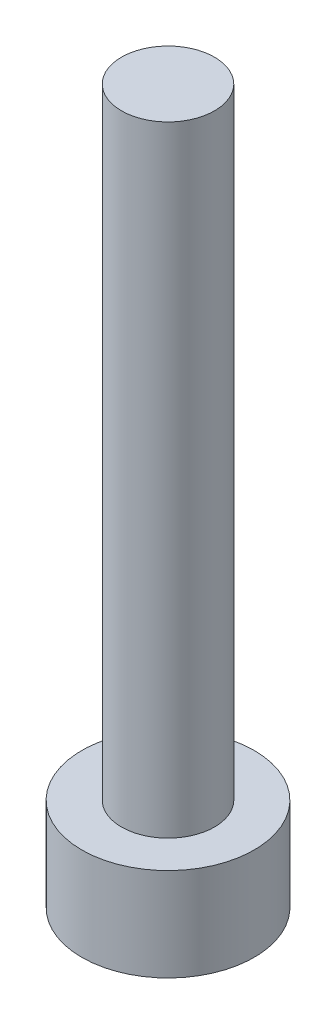
ISO-10303-21;
HEADER;
FILE_DESCRIPTION(('STEP AP214'),'2;1');
FILE_NAME('part.step','',(''),(''),'','','');
FILE_SCHEMA(('AUTOMOTIVE_DESIGN { 1 0 10303 214 1 1 1 1 }'));
ENDSEC;
DATA;
#1=APPLICATION_CONTEXT('core data for automotive mechanical design processes');
#2=APPLICATION_PROTOCOL_DEFINITION('international standard','automotive_design',2000,#1);
#3=PRODUCT_CONTEXT('',#1,'mechanical');
#4=PRODUCT('Part','Part','',(#3));
#5=PRODUCT_RELATED_PRODUCT_CATEGORY('part','',(#4));
#6=PRODUCT_DEFINITION_FORMATION('','',#4);
#7=PRODUCT_DEFINITION_CONTEXT('part definition',#1,'design');
#8=PRODUCT_DEFINITION('design','',#6,#7);
#9=PRODUCT_DEFINITION_SHAPE('','',#8);
#10=(LENGTH_UNIT() NAMED_UNIT(*) SI_UNIT(.MILLI.,.METRE.));
#11=(NAMED_UNIT(*) PLANE_ANGLE_UNIT() SI_UNIT($,.RADIAN.));
#12=(NAMED_UNIT(*) SI_UNIT($,.STERADIAN.) SOLID_ANGLE_UNIT());
#13=UNCERTAINTY_MEASURE_WITH_UNIT(LENGTH_MEASURE(1.E-05),#10,'distance_accuracy_value','');
#14=(GEOMETRIC_REPRESENTATION_CONTEXT(3) GLOBAL_UNCERTAINTY_ASSIGNED_CONTEXT((#13)) GLOBAL_UNIT_ASSIGNED_CONTEXT((#10,
#11,#12)) REPRESENTATION_CONTEXT('',''));
#15=CARTESIAN_POINT('',(0.,0.,0.));
#16=DIRECTION('',(0.,0.,1.));
#17=DIRECTION('',(1.,0.,0.));
#18=AXIS2_PLACEMENT_3D('',#15,#16,#17);
#19=CARTESIAN_POINT('',(0.,3.,0.));
#20=DIRECTION('',(0.,-1.,0.));
#21=DIRECTION('',(0.,0.,-1.));
#22=AXIS2_PLACEMENT_3D('',#19,#20,#21);
#23=CYLINDRICAL_SURFACE('',#22,2.78);
#24=CARTESIAN_POINT('',(0.,3.,0.));
#25=DIRECTION('',(0.,1.,0.));
#26=DIRECTION('',(0.,0.,1.));
#27=AXIS2_PLACEMENT_3D('',#24,#25,#26);
#28=CIRCLE('',#27,2.78);
#29=CARTESIAN_POINT('',(0.,3.,2.78));
#30=VERTEX_POINT('',#29);
#31=EDGE_CURVE('E10',#30,#30,#28,.T.);
#32=ORIENTED_EDGE('',*,*,#31,.F.);
#33=EDGE_LOOP('',(#32));
#34=FACE_BOUND('',#33,.T.);
#35=CARTESIAN_POINT('',(0.,0.,0.));
#36=DIRECTION('',(0.,1.,0.));
#37=DIRECTION('',(0.,0.,1.));
#38=AXIS2_PLACEMENT_3D('',#35,#36,#37);
#39=CIRCLE('',#38,2.78);
#40=CARTESIAN_POINT('',(0.,0.,2.78));
#41=VERTEX_POINT('',#40);
#42=EDGE_CURVE('E34',#41,#41,#39,.T.);
#43=ORIENTED_EDGE('',*,*,#42,.T.);
#44=EDGE_LOOP('',(#43));
#45=FACE_BOUND('',#44,.T.);
#46=ADVANCED_FACE('F31',(#34,#45),#23,.T.);
#47=CARTESIAN_POINT('',(0.,3.,0.));
#48=DIRECTION('',(0.,1.,0.));
#49=DIRECTION('',(0.,0.,1.));
#50=AXIS2_PLACEMENT_3D('',#47,#48,#49);
#51=PLANE('',#50);
#52=CARTESIAN_POINT('',(0.,3.,0.));
#53=DIRECTION('',(0.,1.,0.));
#54=DIRECTION('',(0.,0.,1.));
#55=AXIS2_PLACEMENT_3D('',#52,#53,#54);
#56=CIRCLE('',#55,1.5);
#57=CARTESIAN_POINT('',(0.,3.,1.5));
#58=VERTEX_POINT('',#57);
#59=EDGE_CURVE('E43',#58,#58,#56,.T.);
#60=ORIENTED_EDGE('',*,*,#59,.F.);
#61=EDGE_LOOP('',(#60));
#62=FACE_BOUND('',#61,.T.);
#63=ORIENTED_EDGE('',*,*,#31,.T.);
#64=EDGE_LOOP('',(#63));
#65=FACE_BOUND('',#64,.T.);
#66=ADVANCED_FACE('F58',(#62,#65),#51,.T.);
#67=CARTESIAN_POINT('',(0.,0.,0.));
#68=DIRECTION('',(0.,1.,0.));
#69=DIRECTION('',(0.,0.,1.));
#70=AXIS2_PLACEMENT_3D('',#67,#68,#69);
#71=PLANE('',#70);
#72=ORIENTED_EDGE('',*,*,#42,.F.);
#73=EDGE_LOOP('',(#72));
#74=FACE_BOUND('',#73,.T.);
#75=ADVANCED_FACE('F54',(#74),#71,.F.);
#76=CARTESIAN_POINT('',(0.,23.,0.));
#77=DIRECTION('',(0.,-1.,0.));
#78=DIRECTION('',(0.,0.,-1.));
#79=AXIS2_PLACEMENT_3D('',#76,#77,#78);
#80=CYLINDRICAL_SURFACE('',#79,1.5);
#81=CARTESIAN_POINT('',(0.,23.,0.));
#82=DIRECTION('',(0.,1.,0.));
#83=DIRECTION('',(0.,0.,1.));
#84=AXIS2_PLACEMENT_3D('',#81,#82,#83);
#85=CIRCLE('',#84,1.5);
#86=CARTESIAN_POINT('',(0.,23.,1.5));
#87=VERTEX_POINT('',#86);
#88=EDGE_CURVE('E41',#87,#87,#85,.T.);
#89=ORIENTED_EDGE('',*,*,#88,.F.);
#90=EDGE_LOOP('',(#89));
#91=FACE_BOUND('',#90,.T.);
#92=ORIENTED_EDGE('',*,*,#59,.T.);
#93=EDGE_LOOP('',(#92));
#94=FACE_BOUND('',#93,.T.);
#95=ADVANCED_FACE('F51',(#91,#94),#80,.T.);
#96=CARTESIAN_POINT('',(0.,23.,0.));
#97=DIRECTION('',(0.,1.,0.));
#98=DIRECTION('',(0.,0.,1.));
#99=AXIS2_PLACEMENT_3D('',#96,#97,#98);
#100=PLANE('',#99);
#101=ORIENTED_EDGE('',*,*,#88,.T.);
#102=EDGE_LOOP('',(#101));
#103=FACE_BOUND('',#102,.T.);
#104=ADVANCED_FACE('F49',(#103),#100,.T.);
#105=CLOSED_SHELL('',(#46,#66,#75,#95,#104));
#106=MANIFOLD_SOLID_BREP('B2',#105);
#107=ADVANCED_BREP_SHAPE_REPRESENTATION('',(#18,#106),#14);
#108=SHAPE_DEFINITION_REPRESENTATION(#9,#107);
ENDSEC;
END-ISO-10303-21;
